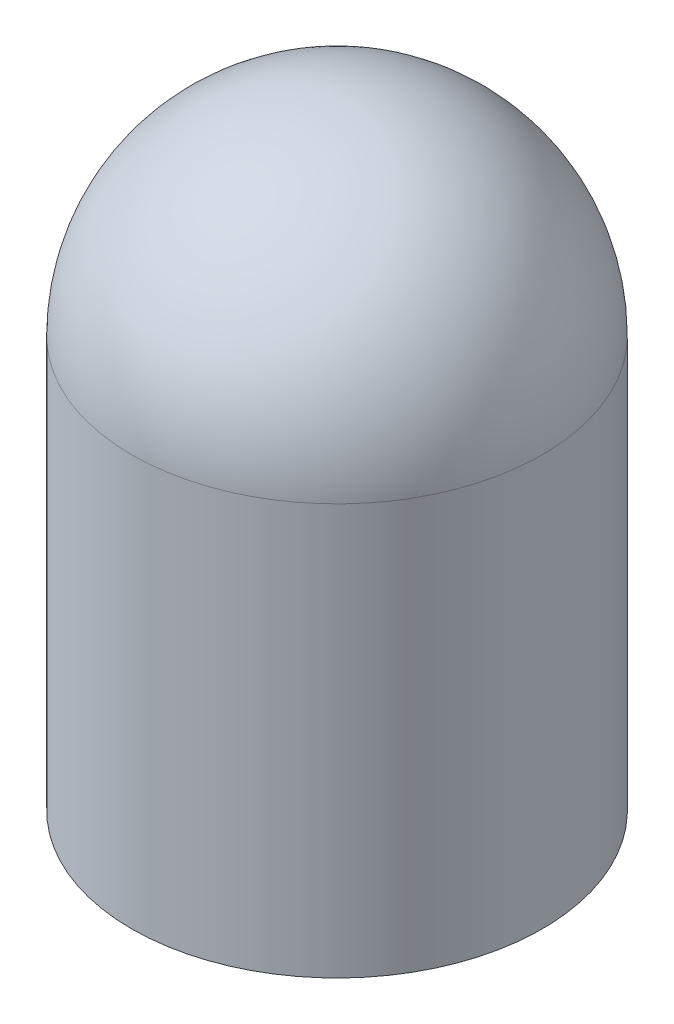
ISO-10303-21;
HEADER;
FILE_DESCRIPTION(('STEP AP214'),'2;1');
FILE_NAME('part.step','',(''),(''),'','','');
FILE_SCHEMA(('AUTOMOTIVE_DESIGN { 1 0 10303 214 1 1 1 1 }'));
ENDSEC;
DATA;
#1=APPLICATION_CONTEXT('core data for automotive mechanical design processes');
#2=APPLICATION_PROTOCOL_DEFINITION('international standard','automotive_design',2000,#1);
#3=PRODUCT_CONTEXT('',#1,'mechanical');
#4=PRODUCT('Part','Part','',(#3));
#5=PRODUCT_RELATED_PRODUCT_CATEGORY('part','',(#4));
#6=PRODUCT_DEFINITION_FORMATION('','',#4);
#7=PRODUCT_DEFINITION_CONTEXT('part definition',#1,'design');
#8=PRODUCT_DEFINITION('design','',#6,#7);
#9=PRODUCT_DEFINITION_SHAPE('','',#8);
#10=(LENGTH_UNIT() NAMED_UNIT(*) SI_UNIT(.MILLI.,.METRE.));
#11=(NAMED_UNIT(*) PLANE_ANGLE_UNIT() SI_UNIT($,.RADIAN.));
#12=(NAMED_UNIT(*) SI_UNIT($,.STERADIAN.) SOLID_ANGLE_UNIT());
#13=UNCERTAINTY_MEASURE_WITH_UNIT(LENGTH_MEASURE(1.E-05),#10,'distance_accuracy_value','');
#14=(GEOMETRIC_REPRESENTATION_CONTEXT(3) GLOBAL_UNCERTAINTY_ASSIGNED_CONTEXT((#13)) GLOBAL_UNIT_ASSIGNED_CONTEXT((#10,
#11,#12)) REPRESENTATION_CONTEXT('',''));
#15=CARTESIAN_POINT('',(0.,0.,0.));
#16=DIRECTION('',(0.,0.,1.));
#17=DIRECTION('',(1.,0.,0.));
#18=AXIS2_PLACEMENT_3D('',#15,#16,#17);
#19=CARTESIAN_POINT('',(0.,0.,0.));
#20=DIRECTION('',(0.,1.,0.));
#21=DIRECTION('',(0.,0.,1.));
#22=AXIS2_PLACEMENT_3D('',#19,#20,#21);
#23=PLANE('',#22);
#24=CARTESIAN_POINT('',(0.,0.,0.));
#25=DIRECTION('',(0.,1.,0.));
#26=DIRECTION('',(0.,0.,1.));
#27=AXIS2_PLACEMENT_3D('',#24,#25,#26);
#28=CIRCLE('',#27,40.);
#29=CARTESIAN_POINT('',(0.,0.,40.));
#30=VERTEX_POINT('',#29);
#31=EDGE_CURVE('E35',#30,#30,#28,.T.);
#32=ORIENTED_EDGE('',*,*,#31,.F.);
#33=EDGE_LOOP('',(#32));
#34=FACE_BOUND('',#33,.T.);
#35=CARTESIAN_POINT('',(0.,0.,0.));
#36=DIRECTION('',(0.,1.,0.));
#37=DIRECTION('',(0.,0.,1.));
#38=AXIS2_PLACEMENT_3D('',#35,#36,#37);
#39=CIRCLE('',#38,36.);
#40=CARTESIAN_POINT('',(0.,0.,36.));
#41=VERTEX_POINT('',#40);
#42=EDGE_CURVE('E42',#41,#41,#39,.T.);
#43=ORIENTED_EDGE('',*,*,#42,.T.);
#44=EDGE_LOOP('',(#43));
#45=FACE_BOUND('',#44,.T.);
#46=ADVANCED_FACE('F31',(#34,#45),#23,.F.);
#47=CARTESIAN_POINT('',(0.,80.,0.));
#48=DIRECTION('',(0.,-1.,0.));
#49=DIRECTION('',(0.,0.,-1.));
#50=AXIS2_PLACEMENT_3D('',#47,#48,#49);
#51=CYLINDRICAL_SURFACE('',#50,40.);
#52=CARTESIAN_POINT('',(0.,80.,0.));
#53=DIRECTION('',(0.,1.,0.));
#54=DIRECTION('',(0.,0.,1.));
#55=AXIS2_PLACEMENT_3D('',#52,#53,#54);
#56=CIRCLE('',#55,40.);
#57=CARTESIAN_POINT('',(0.,80.,40.));
#58=VERTEX_POINT('',#57);
#59=EDGE_CURVE('E10',#58,#58,#56,.T.);
#60=ORIENTED_EDGE('',*,*,#59,.F.);
#61=EDGE_LOOP('',(#60));
#62=FACE_BOUND('',#61,.T.);
#63=ORIENTED_EDGE('',*,*,#31,.T.);
#64=EDGE_LOOP('',(#63));
#65=FACE_BOUND('',#64,.T.);
#66=ADVANCED_FACE('F33',(#62,#65),#51,.T.);
#67=CARTESIAN_POINT('',(0.,80.,0.));
#68=DIRECTION('',(0.,-1.,0.));
#69=DIRECTION('',(0.,0.,-1.));
#70=AXIS2_PLACEMENT_3D('',#67,#68,#69);
#71=CYLINDRICAL_SURFACE('',#70,36.);
#72=CARTESIAN_POINT('',(0.,80.,0.));
#73=DIRECTION('',(0.,1.,0.));
#74=DIRECTION('',(-1.,0.,0.));
#75=AXIS2_PLACEMENT_3D('',#72,#73,#74);
#76=CIRCLE('',#75,36.);
#77=CARTESIAN_POINT('',(-36.,80.,0.));
#78=VERTEX_POINT('',#77);
#79=EDGE_CURVE('E46',#78,#78,#76,.T.);
#80=ORIENTED_EDGE('',*,*,#79,.T.);
#81=EDGE_LOOP('',(#80));
#82=FACE_BOUND('',#81,.T.);
#83=ORIENTED_EDGE('',*,*,#42,.F.);
#84=EDGE_LOOP('',(#83));
#85=FACE_BOUND('',#84,.T.);
#86=ADVANCED_FACE('F50',(#82,#85),#71,.F.);
#87=CARTESIAN_POINT('',(0.,80.,0.));
#88=DIRECTION('',(-1.,0.,0.));
#89=DIRECTION('',(0.,0.,-1.));
#90=AXIS2_PLACEMENT_3D('',#87,#88,#89);
#91=SPHERICAL_SURFACE('',#90,36.);
#92=CARTESIAN_POINT('',(0.,80.,0.));
#93=DIRECTION('',(0.,1.,0.));
#94=DIRECTION('',(-1.,0.,0.));
#95=AXIS2_PLACEMENT_3D('',#92,#93,#94);
#96=SPHERICAL_SURFACE('',#95,36.);
#97=ORIENTED_EDGE('',*,*,#79,.F.);
#98=EDGE_LOOP('',(#97));
#99=FACE_BOUND('',#98,.T.);
#100=ADVANCED_FACE('F53',(#99),#96,.F.);
#101=CARTESIAN_POINT('',(0.,80.,0.));
#102=DIRECTION('',(-1.,0.,0.));
#103=DIRECTION('',(0.,0.,1.));
#104=AXIS2_PLACEMENT_3D('',#101,#102,#103);
#105=SPHERICAL_SURFACE('',#104,40.);
#106=CARTESIAN_POINT('',(0.,80.,0.));
#107=DIRECTION('',(0.,1.,0.));
#108=DIRECTION('',(0.,0.,1.));
#109=AXIS2_PLACEMENT_3D('',#106,#107,#108);
#110=SPHERICAL_SURFACE('',#109,40.);
#111=ORIENTED_EDGE('',*,*,#59,.T.);
#112=EDGE_LOOP('',(#111));
#113=FACE_BOUND('',#112,.T.);
#114=ADVANCED_FACE('F55',(#113),#110,.T.);
#115=CLOSED_SHELL('',(#46,#66,#86,#100,#114));
#116=MANIFOLD_SOLID_BREP('B2',#115);
#117=ADVANCED_BREP_SHAPE_REPRESENTATION('',(#18,#116),#14);
#118=SHAPE_DEFINITION_REPRESENTATION(#9,#117);
ENDSEC;
END-ISO-10303-21;
